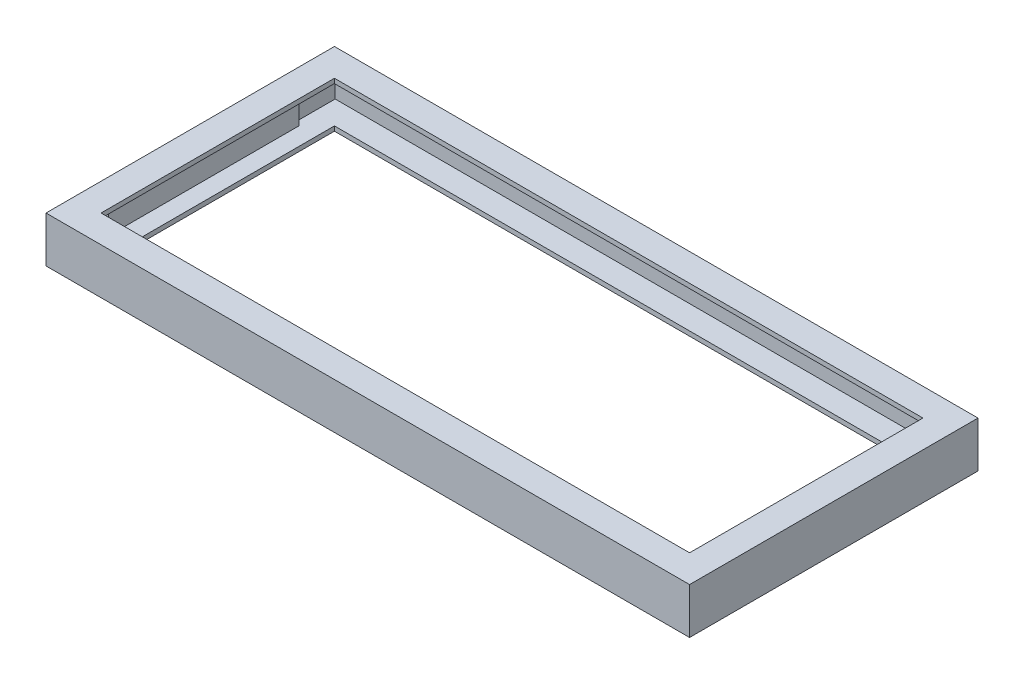
ISO-10303-21;
HEADER;
FILE_DESCRIPTION(('STEP AP214'),'2;1');
FILE_NAME('part.step','',(''),(''),'','','');
FILE_SCHEMA(('AUTOMOTIVE_DESIGN { 1 0 10303 214 1 1 1 1 }'));
ENDSEC;
DATA;
#1=APPLICATION_CONTEXT('core data for automotive mechanical design processes');
#2=APPLICATION_PROTOCOL_DEFINITION('international standard','automotive_design',2000,#1);
#3=PRODUCT_CONTEXT('',#1,'mechanical');
#4=PRODUCT('Part','Part','',(#3));
#5=PRODUCT_RELATED_PRODUCT_CATEGORY('part','',(#4));
#6=PRODUCT_DEFINITION_FORMATION('','',#4);
#7=PRODUCT_DEFINITION_CONTEXT('part definition',#1,'design');
#8=PRODUCT_DEFINITION('design','',#6,#7);
#9=PRODUCT_DEFINITION_SHAPE('','',#8);
#10=(LENGTH_UNIT() NAMED_UNIT(*) SI_UNIT(.MILLI.,.METRE.));
#11=(NAMED_UNIT(*) PLANE_ANGLE_UNIT() SI_UNIT($,.RADIAN.));
#12=(NAMED_UNIT(*) SI_UNIT($,.STERADIAN.) SOLID_ANGLE_UNIT());
#13=UNCERTAINTY_MEASURE_WITH_UNIT(LENGTH_MEASURE(1.E-05),#10,'distance_accuracy_value','');
#14=(GEOMETRIC_REPRESENTATION_CONTEXT(3) GLOBAL_UNCERTAINTY_ASSIGNED_CONTEXT((#13)) GLOBAL_UNIT_ASSIGNED_CONTEXT((#10,
#11,#12)) REPRESENTATION_CONTEXT('',''));
#15=CARTESIAN_POINT('',(0.,0.,0.));
#16=DIRECTION('',(0.,0.,1.));
#17=DIRECTION('',(1.,0.,0.));
#18=AXIS2_PLACEMENT_3D('',#15,#16,#17);
#19=CARTESIAN_POINT('',(0.,10.,0.));
#20=DIRECTION('',(0.,-1.,0.));
#21=DIRECTION('',(0.,0.,-1.));
#22=AXIS2_PLACEMENT_3D('',#19,#20,#21);
#23=PLANE('',#22);
#24=DIRECTION('',(1.,0.,0.));
#25=VECTOR('',#24,1.);
#26=CARTESIAN_POINT('',(6.00000000000001,10.,-6.));
#27=LINE('',#26,#25);
#28=CARTESIAN_POINT('',(6.00000000000001,10.,-6.));
#29=VERTEX_POINT('',#28);
#30=CARTESIAN_POINT('',(134.336754021494,10.,-6.));
#31=VERTEX_POINT('',#30);
#32=EDGE_CURVE('E253',#29,#31,#27,.T.);
#33=ORIENTED_EDGE('',*,*,#32,.F.);
#34=DIRECTION('',(0.,0.,1.));
#35=VECTOR('',#34,1.);
#36=CARTESIAN_POINT('',(6.,10.,-56.8948257352429));
#37=LINE('',#36,#35);
#38=CARTESIAN_POINT('',(6.,10.,-56.8948257352429));
#39=VERTEX_POINT('',#38);
#40=EDGE_CURVE('E50',#39,#29,#37,.T.);
#41=ORIENTED_EDGE('',*,*,#40,.F.);
#42=DIRECTION('',(-1.,0.,0.));
#43=VECTOR('',#42,1.);
#44=CARTESIAN_POINT('',(6.,10.,-56.8948257352429));
#45=LINE('',#44,#43);
#46=CARTESIAN_POINT('',(134.336754021494,10.,-56.8948257352429));
#47=VERTEX_POINT('',#46);
#48=EDGE_CURVE('E244',#47,#39,#45,.T.);
#49=ORIENTED_EDGE('',*,*,#48,.F.);
#50=DIRECTION('',(0.,0.,-1.));
#51=VECTOR('',#50,1.);
#52=CARTESIAN_POINT('',(134.336754021494,10.,-56.8948257352429));
#53=LINE('',#52,#51);
#54=EDGE_CURVE('E247',#31,#47,#53,.T.);
#55=ORIENTED_EDGE('',*,*,#54,.F.);
#56=EDGE_LOOP('',(#33,#41,#49,#55));
#57=FACE_BOUND('',#56,.T.);
#58=DIRECTION('',(0.,0.,1.));
#59=VECTOR('',#58,1.);
#60=CARTESIAN_POINT('',(0.,10.,0.));
#61=LINE('',#60,#59);
#62=CARTESIAN_POINT('',(0.,10.,-62.8948257352429));
#63=VERTEX_POINT('',#62);
#64=CARTESIAN_POINT('',(0.,10.,0.));
#65=VERTEX_POINT('',#64);
#66=EDGE_CURVE('E399',#63,#65,#61,.T.);
#67=ORIENTED_EDGE('',*,*,#66,.T.);
#68=DIRECTION('',(1.,0.,0.));
#69=VECTOR('',#68,1.);
#70=CARTESIAN_POINT('',(0.,10.,0.));
#71=LINE('',#70,#69);
#72=CARTESIAN_POINT('',(140.336754021494,10.,0.));
#73=VERTEX_POINT('',#72);
#74=EDGE_CURVE('E402',#65,#73,#71,.T.);
#75=ORIENTED_EDGE('',*,*,#74,.T.);
#76=DIRECTION('',(0.,0.,-1.));
#77=VECTOR('',#76,1.);
#78=CARTESIAN_POINT('',(140.336754021494,10.,-62.8948257352429));
#79=LINE('',#78,#77);
#80=CARTESIAN_POINT('',(140.336754021494,10.,-62.8948257352429));
#81=VERTEX_POINT('',#80);
#82=EDGE_CURVE('E405',#73,#81,#79,.T.);
#83=ORIENTED_EDGE('',*,*,#82,.T.);
#84=DIRECTION('',(-1.,0.,0.));
#85=VECTOR('',#84,1.);
#86=CARTESIAN_POINT('',(131.35177891646,10.,-62.8948257352429));
#87=LINE('',#86,#85);
#88=EDGE_CURVE('E407',#81,#63,#87,.T.);
#89=ORIENTED_EDGE('',*,*,#88,.T.);
#90=EDGE_LOOP('',(#67,#75,#83,#89));
#91=FACE_BOUND('',#90,.T.);
#92=ADVANCED_FACE('F35',(#57,#91),#23,.F.);
#93=CARTESIAN_POINT('',(0.,0.,0.));
#94=DIRECTION('',(0.,-1.,0.));
#95=DIRECTION('',(0.,0.,-1.));
#96=AXIS2_PLACEMENT_3D('',#93,#94,#95);
#97=PLANE('',#96);
#98=DIRECTION('',(0.,0.,1.));
#99=VECTOR('',#98,1.);
#100=CARTESIAN_POINT('',(6.,0.,-56.8948257352429));
#101=LINE('',#100,#99);
#102=CARTESIAN_POINT('',(6.,0.,-56.8948257352429));
#103=VERTEX_POINT('',#102);
#104=CARTESIAN_POINT('',(6.00000000000001,0.,-6.));
#105=VERTEX_POINT('',#104);
#106=EDGE_CURVE('E227',#103,#105,#101,.T.);
#107=ORIENTED_EDGE('',*,*,#106,.T.);
#108=DIRECTION('',(1.,0.,0.));
#109=VECTOR('',#108,1.);
#110=CARTESIAN_POINT('',(6.00000000000001,0.,-6.));
#111=LINE('',#110,#109);
#112=CARTESIAN_POINT('',(134.336754021494,0.,-6.));
#113=VERTEX_POINT('',#112);
#114=EDGE_CURVE('E235',#105,#113,#111,.T.);
#115=ORIENTED_EDGE('',*,*,#114,.T.);
#116=DIRECTION('',(0.,0.,-1.));
#117=VECTOR('',#116,1.);
#118=CARTESIAN_POINT('',(134.336754021494,0.,-56.8948257352429));
#119=LINE('',#118,#117);
#120=CARTESIAN_POINT('',(134.336754021494,0.,-56.8948257352429));
#121=VERTEX_POINT('',#120);
#122=EDGE_CURVE('E58',#113,#121,#119,.T.);
#123=ORIENTED_EDGE('',*,*,#122,.T.);
#124=DIRECTION('',(-1.,0.,0.));
#125=VECTOR('',#124,1.);
#126=CARTESIAN_POINT('',(6.,0.,-56.8948257352429));
#127=LINE('',#126,#125);
#128=EDGE_CURVE('E243',#121,#103,#127,.T.);
#129=ORIENTED_EDGE('',*,*,#128,.T.);
#130=EDGE_LOOP('',(#107,#115,#123,#129));
#131=FACE_BOUND('',#130,.T.);
#132=DIRECTION('',(0.,0.,1.));
#133=VECTOR('',#132,1.);
#134=CARTESIAN_POINT('',(0.,0.,0.));
#135=LINE('',#134,#133);
#136=CARTESIAN_POINT('',(0.,0.,-62.8948257352429));
#137=VERTEX_POINT('',#136);
#138=CARTESIAN_POINT('',(0.,0.,0.));
#139=VERTEX_POINT('',#138);
#140=EDGE_CURVE('E397',#137,#139,#135,.T.);
#141=ORIENTED_EDGE('',*,*,#140,.F.);
#142=DIRECTION('',(-1.,0.,0.));
#143=VECTOR('',#142,1.);
#144=CARTESIAN_POINT('',(0.,0.,-62.8948257352429));
#145=LINE('',#144,#143);
#146=CARTESIAN_POINT('',(140.336754021494,0.,-62.8948257352429));
#147=VERTEX_POINT('',#146);
#148=EDGE_CURVE('E403',#147,#137,#145,.T.);
#149=ORIENTED_EDGE('',*,*,#148,.F.);
#150=DIRECTION('',(0.,0.,-1.));
#151=VECTOR('',#150,1.);
#152=CARTESIAN_POINT('',(140.336754021494,0.,-62.8948257352429));
#153=LINE('',#152,#151);
#154=CARTESIAN_POINT('',(140.336754021494,0.,0.));
#155=VERTEX_POINT('',#154);
#156=EDGE_CURVE('E414',#155,#147,#153,.T.);
#157=ORIENTED_EDGE('',*,*,#156,.F.);
#158=DIRECTION('',(1.,0.,0.));
#159=VECTOR('',#158,1.);
#160=CARTESIAN_POINT('',(131.35177891646,0.,0.));
#161=LINE('',#160,#159);
#162=EDGE_CURVE('E412',#139,#155,#161,.T.);
#163=ORIENTED_EDGE('',*,*,#162,.F.);
#164=EDGE_LOOP('',(#141,#149,#157,#163));
#165=FACE_BOUND('',#164,.T.);
#166=ADVANCED_FACE('F240',(#131,#165),#97,.T.);
#167=CARTESIAN_POINT('',(0.,10.,0.));
#168=DIRECTION('',(1.,0.,0.));
#169=DIRECTION('',(0.,0.,-1.));
#170=AXIS2_PLACEMENT_3D('',#167,#168,#169);
#171=PLANE('',#170);
#172=ORIENTED_EDGE('',*,*,#140,.T.);
#173=DIRECTION('',(0.,-1.,0.));
#174=VECTOR('',#173,1.);
#175=CARTESIAN_POINT('',(0.,10.,0.));
#176=LINE('',#175,#174);
#177=EDGE_CURVE('E426',#65,#139,#176,.T.);
#178=ORIENTED_EDGE('',*,*,#177,.F.);
#179=ORIENTED_EDGE('',*,*,#66,.F.);
#180=DIRECTION('',(0.,-1.,0.));
#181=VECTOR('',#180,1.);
#182=CARTESIAN_POINT('',(0.,10.,-62.8948257352429));
#183=LINE('',#182,#181);
#184=EDGE_CURVE('E409',#63,#137,#183,.T.);
#185=ORIENTED_EDGE('',*,*,#184,.T.);
#186=EDGE_LOOP('',(#172,#178,#179,#185));
#187=FACE_BOUND('',#186,.T.);
#188=ADVANCED_FACE('F37',(#187),#171,.F.);
#189=CARTESIAN_POINT('',(131.35177891646,10.,0.));
#190=DIRECTION('',(0.,0.,-1.));
#191=DIRECTION('',(-1.,0.,0.));
#192=AXIS2_PLACEMENT_3D('',#189,#190,#191);
#193=PLANE('',#192);
#194=ORIENTED_EDGE('',*,*,#162,.T.);
#195=DIRECTION('',(0.,-1.,0.));
#196=VECTOR('',#195,1.);
#197=CARTESIAN_POINT('',(140.336754021494,10.,0.));
#198=LINE('',#197,#196);
#199=EDGE_CURVE('E423',#73,#155,#198,.T.);
#200=ORIENTED_EDGE('',*,*,#199,.F.);
#201=ORIENTED_EDGE('',*,*,#74,.F.);
#202=ORIENTED_EDGE('',*,*,#177,.T.);
#203=EDGE_LOOP('',(#194,#200,#201,#202));
#204=FACE_BOUND('',#203,.T.);
#205=ADVANCED_FACE('F474',(#204),#193,.F.);
#206=CARTESIAN_POINT('',(140.336754021494,10.,-62.8948257352429));
#207=DIRECTION('',(-1.,0.,0.));
#208=DIRECTION('',(0.,0.,1.));
#209=AXIS2_PLACEMENT_3D('',#206,#207,#208);
#210=PLANE('',#209);
#211=ORIENTED_EDGE('',*,*,#156,.T.);
#212=DIRECTION('',(0.,-1.,0.));
#213=VECTOR('',#212,1.);
#214=CARTESIAN_POINT('',(140.336754021494,10.,-62.8948257352429));
#215=LINE('',#214,#213);
#216=EDGE_CURVE('E420',#81,#147,#215,.T.);
#217=ORIENTED_EDGE('',*,*,#216,.F.);
#218=ORIENTED_EDGE('',*,*,#82,.F.);
#219=ORIENTED_EDGE('',*,*,#199,.T.);
#220=EDGE_LOOP('',(#211,#217,#218,#219));
#221=FACE_BOUND('',#220,.T.);
#222=ADVANCED_FACE('F471',(#221),#210,.F.);
#223=CARTESIAN_POINT('',(0.,10.,-62.8948257352429));
#224=DIRECTION('',(0.,0.,1.));
#225=DIRECTION('',(1.,0.,0.));
#226=AXIS2_PLACEMENT_3D('',#223,#224,#225);
#227=PLANE('',#226);
#228=ORIENTED_EDGE('',*,*,#148,.T.);
#229=ORIENTED_EDGE('',*,*,#184,.F.);
#230=ORIENTED_EDGE('',*,*,#88,.F.);
#231=ORIENTED_EDGE('',*,*,#216,.T.);
#232=EDGE_LOOP('',(#228,#229,#230,#231));
#233=FACE_BOUND('',#232,.T.);
#234=ADVANCED_FACE('F451',(#233),#227,.F.);
#235=CARTESIAN_POINT('',(6.00000000000001,0.,-6.));
#236=DIRECTION('',(0.,0.,1.));
#237=DIRECTION('',(1.,0.,0.));
#238=AXIS2_PLACEMENT_3D('',#235,#236,#237);
#239=PLANE('',#238);
#240=DIRECTION('',(0.,1.,0.));
#241=VECTOR('',#240,1.);
#242=CARTESIAN_POINT('',(134.336754021494,0.,-6.));
#243=LINE('',#242,#241);
#244=CARTESIAN_POINT('',(134.336754021494,1.,-6.));
#245=VERTEX_POINT('',#244);
#246=EDGE_CURVE('E237',#113,#245,#243,.T.);
#247=ORIENTED_EDGE('',*,*,#246,.F.);
#248=ORIENTED_EDGE('',*,*,#114,.F.);
#249=DIRECTION('',(0.,1.,0.));
#250=VECTOR('',#249,1.);
#251=CARTESIAN_POINT('',(6.00000000000001,0.,-6.));
#252=LINE('',#251,#250);
#253=CARTESIAN_POINT('',(6.00000000000001,1.,-6.));
#254=VERTEX_POINT('',#253);
#255=EDGE_CURVE('E222',#105,#254,#252,.T.);
#256=ORIENTED_EDGE('',*,*,#255,.T.);
#257=DIRECTION('',(-1.,0.,0.));
#258=VECTOR('',#257,1.);
#259=CARTESIAN_POINT('',(2.12425489194774,1.,-6.));
#260=LINE('',#259,#258);
#261=EDGE_CURVE('E431',#245,#254,#260,.T.);
#262=ORIENTED_EDGE('',*,*,#261,.F.);
#263=EDGE_LOOP('',(#247,#248,#256,#262));
#264=FACE_BOUND('',#263,.T.);
#265=ADVANCED_FACE('F236',(#264),#239,.F.);
#266=CARTESIAN_POINT('',(134.336754021494,0.,-56.8948257352429));
#267=DIRECTION('',(1.,0.,0.));
#268=DIRECTION('',(0.,0.,-1.));
#269=AXIS2_PLACEMENT_3D('',#266,#267,#268);
#270=PLANE('',#269);
#271=DIRECTION('',(0.,1.,0.));
#272=VECTOR('',#271,1.);
#273=CARTESIAN_POINT('',(134.336754021494,0.,-56.8948257352429));
#274=LINE('',#273,#272);
#275=CARTESIAN_POINT('',(134.336754021494,1.,-56.8948257352429));
#276=VERTEX_POINT('',#275);
#277=EDGE_CURVE('E262',#121,#276,#274,.T.);
#278=ORIENTED_EDGE('',*,*,#277,.F.);
#279=ORIENTED_EDGE('',*,*,#122,.F.);
#280=ORIENTED_EDGE('',*,*,#246,.T.);
#281=DIRECTION('',(0.,0.,1.));
#282=VECTOR('',#281,1.);
#283=CARTESIAN_POINT('',(134.336754021494,1.,-1.));
#284=LINE('',#283,#282);
#285=EDGE_CURVE('E433',#276,#245,#284,.T.);
#286=ORIENTED_EDGE('',*,*,#285,.F.);
#287=EDGE_LOOP('',(#278,#279,#280,#286));
#288=FACE_BOUND('',#287,.T.);
#289=ADVANCED_FACE('F441',(#288),#270,.F.);
#290=CARTESIAN_POINT('',(6.,0.,-56.8948257352429));
#291=DIRECTION('',(0.,0.,-1.));
#292=DIRECTION('',(-1.,0.,0.));
#293=AXIS2_PLACEMENT_3D('',#290,#291,#292);
#294=PLANE('',#293);
#295=DIRECTION('',(0.,1.,0.));
#296=VECTOR('',#295,1.);
#297=CARTESIAN_POINT('',(6.,0.,-56.8948257352429));
#298=LINE('',#297,#296);
#299=CARTESIAN_POINT('',(6.,1.,-56.8948257352429));
#300=VERTEX_POINT('',#299);
#301=EDGE_CURVE('E258',#103,#300,#298,.T.);
#302=ORIENTED_EDGE('',*,*,#301,.F.);
#303=ORIENTED_EDGE('',*,*,#128,.F.);
#304=ORIENTED_EDGE('',*,*,#277,.T.);
#305=DIRECTION('',(1.,0.,0.));
#306=VECTOR('',#305,1.);
#307=CARTESIAN_POINT('',(2.12425489194774,1.,-56.8948257352429));
#308=LINE('',#307,#306);
#309=EDGE_CURVE('E43',#300,#276,#308,.T.);
#310=ORIENTED_EDGE('',*,*,#309,.F.);
#311=EDGE_LOOP('',(#302,#303,#304,#310));
#312=FACE_BOUND('',#311,.T.);
#313=ADVANCED_FACE('F440',(#312),#294,.F.);
#314=CARTESIAN_POINT('',(6.,0.,-56.8948257352429));
#315=DIRECTION('',(-1.,0.,0.));
#316=DIRECTION('',(0.,0.,1.));
#317=AXIS2_PLACEMENT_3D('',#314,#315,#316);
#318=PLANE('',#317);
#319=ORIENTED_EDGE('',*,*,#255,.F.);
#320=ORIENTED_EDGE('',*,*,#106,.F.);
#321=ORIENTED_EDGE('',*,*,#301,.T.);
#322=DIRECTION('',(0.,0.,-1.));
#323=VECTOR('',#322,1.);
#324=CARTESIAN_POINT('',(6.00000000000001,1.,-1.));
#325=LINE('',#324,#323);
#326=EDGE_CURVE('E11',#254,#300,#325,.T.);
#327=ORIENTED_EDGE('',*,*,#326,.F.);
#328=EDGE_LOOP('',(#319,#320,#321,#327));
#329=FACE_BOUND('',#328,.T.);
#330=ADVANCED_FACE('F224',(#329),#318,.F.);
#331=CARTESIAN_POINT('',(6.,9.,-56.8948257352429));
#332=VERTEX_POINT('',#331);
#333=EDGE_CURVE('E261',#332,#39,#298,.T.);
#334=ORIENTED_EDGE('',*,*,#333,.T.);
#335=ORIENTED_EDGE('',*,*,#40,.T.);
#336=CARTESIAN_POINT('',(6.00000000000001,9.,-6.));
#337=VERTEX_POINT('',#336);
#338=EDGE_CURVE('E232',#337,#29,#252,.T.);
#339=ORIENTED_EDGE('',*,*,#338,.F.);
#340=DIRECTION('',(0.,0.,1.));
#341=VECTOR('',#340,1.);
#342=CARTESIAN_POINT('',(6.00000000000001,9.,-1.));
#343=LINE('',#342,#341);
#344=EDGE_CURVE('E275',#332,#337,#343,.T.);
#345=ORIENTED_EDGE('',*,*,#344,.F.);
#346=EDGE_LOOP('',(#334,#335,#339,#345));
#347=FACE_BOUND('',#346,.T.);
#348=ADVANCED_FACE('F526',(#347),#318,.F.);
#349=CARTESIAN_POINT('',(134.336754021494,9.,-56.8948257352429));
#350=VERTEX_POINT('',#349);
#351=EDGE_CURVE('E265',#350,#47,#274,.T.);
#352=ORIENTED_EDGE('',*,*,#351,.T.);
#353=ORIENTED_EDGE('',*,*,#48,.T.);
#354=ORIENTED_EDGE('',*,*,#333,.F.);
#355=DIRECTION('',(-1.,0.,0.));
#356=VECTOR('',#355,1.);
#357=CARTESIAN_POINT('',(2.12425489194774,9.,-56.8948257352429));
#358=LINE('',#357,#356);
#359=EDGE_CURVE('E272',#350,#332,#358,.T.);
#360=ORIENTED_EDGE('',*,*,#359,.F.);
#361=EDGE_LOOP('',(#352,#353,#354,#360));
#362=FACE_BOUND('',#361,.T.);
#363=ADVANCED_FACE('F450',(#362),#294,.F.);
#364=CARTESIAN_POINT('',(134.336754021494,9.,-6.));
#365=VERTEX_POINT('',#364);
#366=EDGE_CURVE('E231',#365,#31,#243,.T.);
#367=ORIENTED_EDGE('',*,*,#366,.T.);
#368=ORIENTED_EDGE('',*,*,#54,.T.);
#369=ORIENTED_EDGE('',*,*,#351,.F.);
#370=DIRECTION('',(0.,0.,-1.));
#371=VECTOR('',#370,1.);
#372=CARTESIAN_POINT('',(134.336754021494,9.,-1.));
#373=LINE('',#372,#371);
#374=EDGE_CURVE('E269',#365,#350,#373,.T.);
#375=ORIENTED_EDGE('',*,*,#374,.F.);
#376=EDGE_LOOP('',(#367,#368,#369,#375));
#377=FACE_BOUND('',#376,.T.);
#378=ADVANCED_FACE('F444',(#377),#270,.F.);
#379=ORIENTED_EDGE('',*,*,#338,.T.);
#380=ORIENTED_EDGE('',*,*,#32,.T.);
#381=ORIENTED_EDGE('',*,*,#366,.F.);
#382=DIRECTION('',(1.,0.,0.));
#383=VECTOR('',#382,1.);
#384=CARTESIAN_POINT('',(2.12425489194774,9.,-6.));
#385=LINE('',#384,#383);
#386=EDGE_CURVE('E260',#337,#365,#385,.T.);
#387=ORIENTED_EDGE('',*,*,#386,.F.);
#388=EDGE_LOOP('',(#379,#380,#381,#387));
#389=FACE_BOUND('',#388,.T.);
#390=ADVANCED_FACE('F453',(#389),#239,.F.);
#391=CARTESIAN_POINT('',(11.1242548919477,0.,0.));
#392=DIRECTION('',(1.,0.,0.));
#393=DIRECTION('',(0.,0.,-1.));
#394=AXIS2_PLACEMENT_3D('',#391,#392,#393);
#395=PLANE('',#394);
#396=DIRECTION('',(0.,1.,0.));
#397=VECTOR('',#396,1.);
#398=CARTESIAN_POINT('',(11.1242548919477,0.,-2.55211084933033));
#399=LINE('',#398,#397);
#400=CARTESIAN_POINT('',(11.1242548919478,1.,-2.55211084933033));
#401=VERTEX_POINT('',#400);
#402=CARTESIAN_POINT('',(11.1242548919478,9.,-2.55211084933033));
#403=VERTEX_POINT('',#402);
#404=EDGE_CURVE('E302',#401,#403,#399,.T.);
#405=ORIENTED_EDGE('',*,*,#404,.F.);
#406=DIRECTION('',(0.,0.,-1.));
#407=VECTOR('',#406,1.);
#408=CARTESIAN_POINT('',(11.1242548919477,1.,-1.));
#409=LINE('',#408,#407);
#410=CARTESIAN_POINT('',(11.1242548919477,1.,-1.));
#411=VERTEX_POINT('',#410);
#412=EDGE_CURVE('E390',#411,#401,#409,.T.);
#413=ORIENTED_EDGE('',*,*,#412,.F.);
#414=DIRECTION('',(0.,-1.,0.));
#415=VECTOR('',#414,1.);
#416=CARTESIAN_POINT('',(11.1242548919477,9.,-1.));
#417=LINE('',#416,#415);
#418=CARTESIAN_POINT('',(11.1242548919477,9.,-1.));
#419=VERTEX_POINT('',#418);
#420=EDGE_CURVE('E367',#419,#411,#417,.T.);
#421=ORIENTED_EDGE('',*,*,#420,.F.);
#422=DIRECTION('',(0.,0.,1.));
#423=VECTOR('',#422,1.);
#424=CARTESIAN_POINT('',(11.1242548919477,9.,-1.));
#425=LINE('',#424,#423);
#426=EDGE_CURVE('E379',#403,#419,#425,.T.);
#427=ORIENTED_EDGE('',*,*,#426,.F.);
#428=EDGE_LOOP('',(#405,#413,#421,#427));
#429=FACE_BOUND('',#428,.T.);
#430=ADVANCED_FACE('F556',(#429),#395,.F.);
#431=CARTESIAN_POINT('',(2.12425489194774,9.,-1.));
#432=DIRECTION('',(0.,0.,1.));
#433=DIRECTION('',(0.,-1.,0.));
#434=AXIS2_PLACEMENT_3D('',#431,#432,#433);
#435=PLANE('',#434);
#436=ORIENTED_EDGE('',*,*,#420,.T.);
#437=DIRECTION('',(1.,0.,0.));
#438=VECTOR('',#437,1.);
#439=CARTESIAN_POINT('',(2.12425489194774,1.,-1.));
#440=LINE('',#439,#438);
#441=CARTESIAN_POINT('',(2.12425489194774,1.,-1.));
#442=VERTEX_POINT('',#441);
#443=EDGE_CURVE('E387',#442,#411,#440,.T.);
#444=ORIENTED_EDGE('',*,*,#443,.F.);
#445=DIRECTION('',(0.,-1.,0.));
#446=VECTOR('',#445,1.);
#447=CARTESIAN_POINT('',(2.12425489194774,9.,-1.));
#448=LINE('',#447,#446);
#449=CARTESIAN_POINT('',(2.12425489194774,9.,-1.));
#450=VERTEX_POINT('',#449);
#451=EDGE_CURVE('E375',#450,#442,#448,.T.);
#452=ORIENTED_EDGE('',*,*,#451,.F.);
#453=DIRECTION('',(1.,0.,0.));
#454=VECTOR('',#453,1.);
#455=CARTESIAN_POINT('',(2.12425489194774,9.,-1.));
#456=LINE('',#455,#454);
#457=EDGE_CURVE('E394',#450,#419,#456,.T.);
#458=ORIENTED_EDGE('',*,*,#457,.T.);
#459=EDGE_LOOP('',(#436,#444,#452,#458));
#460=FACE_BOUND('',#459,.T.);
#461=ADVANCED_FACE('F466',(#460),#435,.F.);
#462=CARTESIAN_POINT('',(2.12425489194774,0.,0.));
#463=DIRECTION('',(1.,0.,0.));
#464=DIRECTION('',(0.,0.,-1.));
#465=AXIS2_PLACEMENT_3D('',#462,#463,#464);
#466=PLANE('',#465);
#467=DIRECTION('',(0.,0.,-1.));
#468=VECTOR('',#467,1.);
#469=CARTESIAN_POINT('',(2.12425489194774,1.,-1.));
#470=LINE('',#469,#468);
#471=CARTESIAN_POINT('',(2.12425489194779,1.,-2.55211084933033));
#472=VERTEX_POINT('',#471);
#473=EDGE_CURVE('E380',#442,#472,#470,.T.);
#474=ORIENTED_EDGE('',*,*,#473,.T.);
#475=DIRECTION('',(0.,1.,0.));
#476=VECTOR('',#475,1.);
#477=CARTESIAN_POINT('',(2.12425489194774,0.,-2.55211084933033));
#478=LINE('',#477,#476);
#479=CARTESIAN_POINT('',(2.12425489194779,9.,-2.55211084933033));
#480=VERTEX_POINT('',#479);
#481=EDGE_CURVE('E304',#472,#480,#478,.T.);
#482=ORIENTED_EDGE('',*,*,#481,.T.);
#483=DIRECTION('',(0.,0.,1.));
#484=VECTOR('',#483,1.);
#485=CARTESIAN_POINT('',(2.12425489194774,9.,-1.));
#486=LINE('',#485,#484);
#487=EDGE_CURVE('E383',#480,#450,#486,.T.);
#488=ORIENTED_EDGE('',*,*,#487,.T.);
#489=ORIENTED_EDGE('',*,*,#451,.T.);
#490=EDGE_LOOP('',(#474,#482,#488,#489));
#491=FACE_BOUND('',#490,.T.);
#492=ADVANCED_FACE('F606',(#491),#466,.T.);
#493=CARTESIAN_POINT('',(0.,0.,-2.55211084933033));
#494=DIRECTION('',(0.,0.,-1.));
#495=DIRECTION('',(-1.,0.,0.));
#496=AXIS2_PLACEMENT_3D('',#493,#494,#495);
#497=PLANE('',#496);
#498=DIRECTION('',(-1.,0.,0.));
#499=VECTOR('',#498,1.);
#500=CARTESIAN_POINT('',(139.336754021494,1.,-2.55211084933033));
#501=LINE('',#500,#499);
#502=CARTESIAN_POINT('',(1.,1.,-2.55211084933033));
#503=VERTEX_POINT('',#502);
#504=EDGE_CURVE('E279',#472,#503,#501,.T.);
#505=ORIENTED_EDGE('',*,*,#504,.T.);
#506=DIRECTION('',(0.,1.,0.));
#507=VECTOR('',#506,1.);
#508=CARTESIAN_POINT('',(1.,9.,-2.55211084933033));
#509=LINE('',#508,#507);
#510=CARTESIAN_POINT('',(1.,9.,-2.55211084933033));
#511=VERTEX_POINT('',#510);
#512=EDGE_CURVE('E283',#503,#511,#509,.T.);
#513=ORIENTED_EDGE('',*,*,#512,.T.);
#514=DIRECTION('',(1.,0.,0.));
#515=VECTOR('',#514,1.);
#516=CARTESIAN_POINT('',(139.336754021494,9.,-2.55211084933033));
#517=LINE('',#516,#515);
#518=EDGE_CURVE('E287',#511,#480,#517,.T.);
#519=ORIENTED_EDGE('',*,*,#518,.T.);
#520=ORIENTED_EDGE('',*,*,#481,.F.);
#521=EDGE_LOOP('',(#505,#513,#519,#520));
#522=FACE_BOUND('',#521,.T.);
#523=ADVANCED_FACE('F590',(#522),#497,.T.);
#524=CARTESIAN_POINT('',(1.,9.,-2.55211084933033));
#525=DIRECTION('',(-1.,0.,0.));
#526=DIRECTION('',(0.,0.,1.));
#527=AXIS2_PLACEMENT_3D('',#524,#525,#526);
#528=PLANE('',#527);
#529=DIRECTION('',(0.,1.,0.));
#530=VECTOR('',#529,1.);
#531=CARTESIAN_POINT('',(1.,9.,-11.5521108493303));
#532=LINE('',#531,#530);
#533=CARTESIAN_POINT('',(1.,1.,-11.5521108493303));
#534=VERTEX_POINT('',#533);
#535=CARTESIAN_POINT('',(1.,9.,-11.5521108493303));
#536=VERTEX_POINT('',#535);
#537=EDGE_CURVE('E291',#534,#536,#532,.T.);
#538=ORIENTED_EDGE('',*,*,#537,.T.);
#539=DIRECTION('',(0.,0.,-1.));
#540=VECTOR('',#539,1.);
#541=CARTESIAN_POINT('',(1.,9.,-2.55211084933033));
#542=LINE('',#541,#540);
#543=EDGE_CURVE('E296',#511,#536,#542,.T.);
#544=ORIENTED_EDGE('',*,*,#543,.F.);
#545=ORIENTED_EDGE('',*,*,#512,.F.);
#546=DIRECTION('',(0.,0.,-1.));
#547=VECTOR('',#546,1.);
#548=CARTESIAN_POINT('',(1.,1.,-2.55211084933033));
#549=LINE('',#548,#547);
#550=EDGE_CURVE('E289',#503,#534,#549,.T.);
#551=ORIENTED_EDGE('',*,*,#550,.T.);
#552=EDGE_LOOP('',(#538,#544,#545,#551));
#553=FACE_BOUND('',#552,.T.);
#554=ADVANCED_FACE('F605',(#553),#528,.F.);
#555=CARTESIAN_POINT('',(0.,0.,-11.5521108493303));
#556=DIRECTION('',(0.,0.,-1.));
#557=DIRECTION('',(-1.,0.,0.));
#558=AXIS2_PLACEMENT_3D('',#555,#556,#557);
#559=PLANE('',#558);
#560=DIRECTION('',(0.,1.,0.));
#561=VECTOR('',#560,1.);
#562=CARTESIAN_POINT('',(2.12425489194774,0.,-11.5521108493303));
#563=LINE('',#562,#561);
#564=CARTESIAN_POINT('',(2.12425489194774,1.,-11.5521108493303));
#565=VERTEX_POINT('',#564);
#566=CARTESIAN_POINT('',(2.12425489194779,9.,-11.5521108493303));
#567=VERTEX_POINT('',#566);
#568=EDGE_CURVE('E298',#565,#567,#563,.T.);
#569=ORIENTED_EDGE('',*,*,#568,.T.);
#570=DIRECTION('',(1.,0.,0.));
#571=VECTOR('',#570,1.);
#572=CARTESIAN_POINT('',(139.336754021494,9.,-11.5521108493303));
#573=LINE('',#572,#571);
#574=EDGE_CURVE('E282',#536,#567,#573,.T.);
#575=ORIENTED_EDGE('',*,*,#574,.F.);
#576=ORIENTED_EDGE('',*,*,#537,.F.);
#577=DIRECTION('',(-1.,0.,0.));
#578=VECTOR('',#577,1.);
#579=CARTESIAN_POINT('',(139.336754021494,1.,-11.5521108493303));
#580=LINE('',#579,#578);
#581=EDGE_CURVE('E278',#565,#534,#580,.T.);
#582=ORIENTED_EDGE('',*,*,#581,.F.);
#583=EDGE_LOOP('',(#569,#575,#576,#582));
#584=FACE_BOUND('',#583,.T.);
#585=ADVANCED_FACE('F614',(#584),#559,.F.);
#586=ORIENTED_EDGE('',*,*,#568,.F.);
#587=CARTESIAN_POINT('',(2.12425489194774,1.,-53.054138715443));
#588=VERTEX_POINT('',#587);
#589=EDGE_CURVE('E378',#565,#588,#470,.T.);
#590=ORIENTED_EDGE('',*,*,#589,.T.);
#591=DIRECTION('',(0.,-1.,0.));
#592=VECTOR('',#591,1.);
#593=CARTESIAN_POINT('',(2.12425489194774,0.,-53.054138715443));
#594=LINE('',#593,#592);
#595=CARTESIAN_POINT('',(2.12425489194774,9.,-53.054138715443));
#596=VERTEX_POINT('',#595);
#597=EDGE_CURVE('E331',#596,#588,#594,.T.);
#598=ORIENTED_EDGE('',*,*,#597,.F.);
#599=EDGE_CURVE('E384',#596,#567,#486,.T.);
#600=ORIENTED_EDGE('',*,*,#599,.T.);
#601=EDGE_LOOP('',(#586,#590,#598,#600));
#602=FACE_BOUND('',#601,.T.);
#603=ADVANCED_FACE('F597',(#602),#466,.T.);
#604=CARTESIAN_POINT('',(0.,0.,-53.054138715443));
#605=DIRECTION('',(0.,0.,1.));
#606=DIRECTION('',(1.,0.,0.));
#607=AXIS2_PLACEMENT_3D('',#604,#605,#606);
#608=PLANE('',#607);
#609=ORIENTED_EDGE('',*,*,#597,.T.);
#610=DIRECTION('',(1.,0.,0.));
#611=VECTOR('',#610,1.);
#612=CARTESIAN_POINT('',(1.,1.,-53.054138715443));
#613=LINE('',#612,#611);
#614=CARTESIAN_POINT('',(1.,1.,-53.054138715443));
#615=VERTEX_POINT('',#614);
#616=EDGE_CURVE('E324',#615,#588,#613,.T.);
#617=ORIENTED_EDGE('',*,*,#616,.F.);
#618=DIRECTION('',(0.,-1.,0.));
#619=VECTOR('',#618,1.);
#620=CARTESIAN_POINT('',(1.,9.,-53.054138715443));
#621=LINE('',#620,#619);
#622=CARTESIAN_POINT('',(1.,9.,-53.054138715443));
#623=VERTEX_POINT('',#622);
#624=EDGE_CURVE('E307',#623,#615,#621,.T.);
#625=ORIENTED_EDGE('',*,*,#624,.F.);
#626=DIRECTION('',(-1.,0.,0.));
#627=VECTOR('',#626,1.);
#628=CARTESIAN_POINT('',(1.,9.,-53.054138715443));
#629=LINE('',#628,#627);
#630=EDGE_CURVE('E312',#596,#623,#629,.T.);
#631=ORIENTED_EDGE('',*,*,#630,.F.);
#632=EDGE_LOOP('',(#609,#617,#625,#631));
#633=FACE_BOUND('',#632,.T.);
#634=ADVANCED_FACE('F635',(#633),#608,.F.);
#635=CARTESIAN_POINT('',(1.,9.,-62.054138715443));
#636=DIRECTION('',(-1.,0.,0.));
#637=DIRECTION('',(0.,-1.,0.));
#638=AXIS2_PLACEMENT_3D('',#635,#636,#637);
#639=PLANE('',#638);
#640=ORIENTED_EDGE('',*,*,#624,.T.);
#641=DIRECTION('',(0.,0.,1.));
#642=VECTOR('',#641,1.);
#643=CARTESIAN_POINT('',(1.,1.,-62.054138715443));
#644=LINE('',#643,#642);
#645=CARTESIAN_POINT('',(1.,1.,-62.054138715443));
#646=VERTEX_POINT('',#645);
#647=EDGE_CURVE('E321',#646,#615,#644,.T.);
#648=ORIENTED_EDGE('',*,*,#647,.F.);
#649=DIRECTION('',(0.,-1.,0.));
#650=VECTOR('',#649,1.);
#651=CARTESIAN_POINT('',(1.,9.,-62.054138715443));
#652=LINE('',#651,#650);
#653=CARTESIAN_POINT('',(1.,9.,-62.054138715443));
#654=VERTEX_POINT('',#653);
#655=EDGE_CURVE('E308',#654,#646,#652,.T.);
#656=ORIENTED_EDGE('',*,*,#655,.F.);
#657=DIRECTION('',(0.,0.,1.));
#658=VECTOR('',#657,1.);
#659=CARTESIAN_POINT('',(1.,9.,-62.054138715443));
#660=LINE('',#659,#658);
#661=EDGE_CURVE('E328',#654,#623,#660,.T.);
#662=ORIENTED_EDGE('',*,*,#661,.T.);
#663=EDGE_LOOP('',(#640,#648,#656,#662));
#664=FACE_BOUND('',#663,.T.);
#665=ADVANCED_FACE('F633',(#664),#639,.F.);
#666=CARTESIAN_POINT('',(0.,0.,-62.054138715443));
#667=DIRECTION('',(0.,0.,1.));
#668=DIRECTION('',(1.,0.,0.));
#669=AXIS2_PLACEMENT_3D('',#666,#667,#668);
#670=PLANE('',#669);
#671=ORIENTED_EDGE('',*,*,#655,.T.);
#672=DIRECTION('',(1.,0.,0.));
#673=VECTOR('',#672,1.);
#674=CARTESIAN_POINT('',(1.,1.,-62.054138715443));
#675=LINE('',#674,#673);
#676=CARTESIAN_POINT('',(139.336754021494,1.,-62.054138715443));
#677=VERTEX_POINT('',#676);
#678=EDGE_CURVE('E311',#646,#677,#675,.T.);
#679=ORIENTED_EDGE('',*,*,#678,.T.);
#680=DIRECTION('',(0.,1.,0.));
#681=VECTOR('',#680,1.);
#682=CARTESIAN_POINT('',(139.336754021494,9.,-62.054138715443));
#683=LINE('',#682,#681);
#684=CARTESIAN_POINT('',(139.336754021494,9.,-62.054138715443));
#685=VERTEX_POINT('',#684);
#686=EDGE_CURVE('E315',#677,#685,#683,.T.);
#687=ORIENTED_EDGE('',*,*,#686,.T.);
#688=DIRECTION('',(-1.,0.,0.));
#689=VECTOR('',#688,1.);
#690=CARTESIAN_POINT('',(1.,9.,-62.054138715443));
#691=LINE('',#690,#689);
#692=EDGE_CURVE('E318',#685,#654,#691,.T.);
#693=ORIENTED_EDGE('',*,*,#692,.T.);
#694=EDGE_LOOP('',(#671,#679,#687,#693));
#695=FACE_BOUND('',#694,.T.);
#696=ADVANCED_FACE('F629',(#695),#670,.T.);
#697=CARTESIAN_POINT('',(139.336754021494,9.,-62.054138715443));
#698=DIRECTION('',(1.,0.,0.));
#699=DIRECTION('',(0.,0.,-1.));
#700=AXIS2_PLACEMENT_3D('',#697,#698,#699);
#701=PLANE('',#700);
#702=DIRECTION('',(0.,0.,1.));
#703=VECTOR('',#702,1.);
#704=CARTESIAN_POINT('',(139.336754021494,9.,-62.054138715443));
#705=LINE('',#704,#703);
#706=CARTESIAN_POINT('',(139.336754021494,9.,-61.8948257352429));
#707=VERTEX_POINT('',#706);
#708=EDGE_CURVE('E332',#685,#707,#705,.T.);
#709=ORIENTED_EDGE('',*,*,#708,.F.);
#710=ORIENTED_EDGE('',*,*,#686,.F.);
#711=DIRECTION('',(0.,0.,1.));
#712=VECTOR('',#711,1.);
#713=CARTESIAN_POINT('',(139.336754021494,1.,-62.054138715443));
#714=LINE('',#713,#712);
#715=CARTESIAN_POINT('',(139.336754021494,1.,-61.8948257352429));
#716=VERTEX_POINT('',#715);
#717=EDGE_CURVE('E335',#677,#716,#714,.T.);
#718=ORIENTED_EDGE('',*,*,#717,.T.);
#719=DIRECTION('',(0.,-1.,0.));
#720=VECTOR('',#719,1.);
#721=CARTESIAN_POINT('',(139.336754021494,9.,-61.8948257352429));
#722=LINE('',#721,#720);
#723=EDGE_CURVE('E340',#707,#716,#722,.T.);
#724=ORIENTED_EDGE('',*,*,#723,.F.);
#725=EDGE_LOOP('',(#709,#710,#718,#724));
#726=FACE_BOUND('',#725,.T.);
#727=ADVANCED_FACE('F632',(#726),#701,.F.);
#728=CARTESIAN_POINT('',(139.35177891646,9.,-61.8948257352429));
#729=DIRECTION('',(0.,0.,-1.));
#730=DIRECTION('',(-1.,0.,0.));
#731=AXIS2_PLACEMENT_3D('',#728,#729,#730);
#732=PLANE('',#731);
#733=DIRECTION('',(-1.,0.,0.));
#734=VECTOR('',#733,1.);
#735=CARTESIAN_POINT('',(139.35177891646,9.,-61.8948257352429));
#736=LINE('',#735,#734);
#737=CARTESIAN_POINT('',(139.35177891646,9.,-61.8948257352429));
#738=VERTEX_POINT('',#737);
#739=EDGE_CURVE('E364',#738,#707,#736,.T.);
#740=ORIENTED_EDGE('',*,*,#739,.T.);
#741=ORIENTED_EDGE('',*,*,#723,.T.);
#742=DIRECTION('',(-1.,0.,0.));
#743=VECTOR('',#742,1.);
#744=CARTESIAN_POINT('',(139.35177891646,1.,-61.8948257352429));
#745=LINE('',#744,#743);
#746=CARTESIAN_POINT('',(139.35177891646,1.,-61.8948257352429));
#747=VERTEX_POINT('',#746);
#748=EDGE_CURVE('E357',#747,#716,#745,.T.);
#749=ORIENTED_EDGE('',*,*,#748,.F.);
#750=DIRECTION('',(0.,-1.,0.));
#751=VECTOR('',#750,1.);
#752=CARTESIAN_POINT('',(139.35177891646,9.,-61.8948257352429));
#753=LINE('',#752,#751);
#754=EDGE_CURVE('E344',#738,#747,#753,.T.);
#755=ORIENTED_EDGE('',*,*,#754,.F.);
#756=EDGE_LOOP('',(#740,#741,#749,#755));
#757=FACE_BOUND('',#756,.T.);
#758=ADVANCED_FACE('F641',(#757),#732,.F.);
#759=CARTESIAN_POINT('',(139.35177891646,0.,0.));
#760=DIRECTION('',(-1.,0.,0.));
#761=DIRECTION('',(0.,0.,1.));
#762=AXIS2_PLACEMENT_3D('',#759,#760,#761);
#763=PLANE('',#762);
#764=ORIENTED_EDGE('',*,*,#754,.T.);
#765=DIRECTION('',(0.,0.,1.));
#766=VECTOR('',#765,1.);
#767=CARTESIAN_POINT('',(139.35177891646,1.,-61.8948257352429));
#768=LINE('',#767,#766);
#769=CARTESIAN_POINT('',(139.35177891646,1.,-1.));
#770=VERTEX_POINT('',#769);
#771=EDGE_CURVE('E347',#747,#770,#768,.T.);
#772=ORIENTED_EDGE('',*,*,#771,.T.);
#773=DIRECTION('',(0.,1.,0.));
#774=VECTOR('',#773,1.);
#775=CARTESIAN_POINT('',(139.35177891646,9.,-1.));
#776=LINE('',#775,#774);
#777=CARTESIAN_POINT('',(139.35177891646,9.,-1.));
#778=VERTEX_POINT('',#777);
#779=EDGE_CURVE('E351',#770,#778,#776,.T.);
#780=ORIENTED_EDGE('',*,*,#779,.T.);
#781=DIRECTION('',(0.,0.,-1.));
#782=VECTOR('',#781,1.);
#783=CARTESIAN_POINT('',(139.35177891646,9.,-61.8948257352429));
#784=LINE('',#783,#782);
#785=EDGE_CURVE('E354',#778,#738,#784,.T.);
#786=ORIENTED_EDGE('',*,*,#785,.T.);
#787=EDGE_LOOP('',(#764,#772,#780,#786));
#788=FACE_BOUND('',#787,.T.);
#789=ADVANCED_FACE('F646',(#788),#763,.T.);
#790=CARTESIAN_POINT('',(139.35177891646,9.,-1.));
#791=DIRECTION('',(0.,0.,1.));
#792=DIRECTION('',(1.,0.,0.));
#793=AXIS2_PLACEMENT_3D('',#790,#791,#792);
#794=PLANE('',#793);
#795=DIRECTION('',(0.,1.,0.));
#796=VECTOR('',#795,1.);
#797=CARTESIAN_POINT('',(131.35177891646,9.,-1.));
#798=LINE('',#797,#796);
#799=CARTESIAN_POINT('',(131.35177891646,1.,-1.));
#800=VERTEX_POINT('',#799);
#801=CARTESIAN_POINT('',(131.35177891646,9.,-1.));
#802=VERTEX_POINT('',#801);
#803=EDGE_CURVE('E359',#800,#802,#798,.T.);
#804=ORIENTED_EDGE('',*,*,#803,.T.);
#805=DIRECTION('',(-1.,0.,0.));
#806=VECTOR('',#805,1.);
#807=CARTESIAN_POINT('',(139.35177891646,9.,-1.));
#808=LINE('',#807,#806);
#809=EDGE_CURVE('E368',#778,#802,#808,.T.);
#810=ORIENTED_EDGE('',*,*,#809,.F.);
#811=ORIENTED_EDGE('',*,*,#779,.F.);
#812=DIRECTION('',(-1.,0.,0.));
#813=VECTOR('',#812,1.);
#814=CARTESIAN_POINT('',(139.35177891646,1.,-1.));
#815=LINE('',#814,#813);
#816=EDGE_CURVE('E370',#770,#800,#815,.T.);
#817=ORIENTED_EDGE('',*,*,#816,.T.);
#818=EDGE_LOOP('',(#804,#810,#811,#817));
#819=FACE_BOUND('',#818,.T.);
#820=ADVANCED_FACE('F649',(#819),#794,.F.);
#821=CARTESIAN_POINT('',(131.35177891646,0.,0.));
#822=DIRECTION('',(-1.,0.,0.));
#823=DIRECTION('',(0.,0.,1.));
#824=AXIS2_PLACEMENT_3D('',#821,#822,#823);
#825=PLANE('',#824);
#826=DIRECTION('',(0.,-1.,0.));
#827=VECTOR('',#826,1.);
#828=CARTESIAN_POINT('',(131.35177891646,0.,-2.55211084933033));
#829=LINE('',#828,#827);
#830=CARTESIAN_POINT('',(131.35177891646,9.,-2.55211084933035));
#831=VERTEX_POINT('',#830);
#832=CARTESIAN_POINT('',(131.35177891646,1.,-2.55211084933033));
#833=VERTEX_POINT('',#832);
#834=EDGE_CURVE('E429',#831,#833,#829,.T.);
#835=ORIENTED_EDGE('',*,*,#834,.F.);
#836=DIRECTION('',(0.,0.,-1.));
#837=VECTOR('',#836,1.);
#838=CARTESIAN_POINT('',(131.35177891646,9.,-61.8948257352429));
#839=LINE('',#838,#837);
#840=EDGE_CURVE('E348',#802,#831,#839,.T.);
#841=ORIENTED_EDGE('',*,*,#840,.F.);
#842=ORIENTED_EDGE('',*,*,#803,.F.);
#843=DIRECTION('',(0.,0.,1.));
#844=VECTOR('',#843,1.);
#845=CARTESIAN_POINT('',(131.35177891646,1.,-61.8948257352429));
#846=LINE('',#845,#844);
#847=EDGE_CURVE('E343',#833,#800,#846,.T.);
#848=ORIENTED_EDGE('',*,*,#847,.F.);
#849=EDGE_LOOP('',(#835,#841,#842,#848));
#850=FACE_BOUND('',#849,.T.);
#851=ADVANCED_FACE('F568',(#850),#825,.F.);
#852=CARTESIAN_POINT('',(2.12425489194774,9.,-1.));
#853=DIRECTION('',(0.,1.,0.));
#854=DIRECTION('',(0.,0.,1.));
#855=AXIS2_PLACEMENT_3D('',#852,#853,#854);
#856=PLANE('',#855);
#857=ORIENTED_EDGE('',*,*,#359,.T.);
#858=ORIENTED_EDGE('',*,*,#344,.T.);
#859=ORIENTED_EDGE('',*,*,#386,.T.);
#860=ORIENTED_EDGE('',*,*,#374,.T.);
#861=EDGE_LOOP('',(#857,#858,#859,#860));
#862=FACE_BOUND('',#861,.T.);
#863=ORIENTED_EDGE('',*,*,#840,.T.);
#864=EDGE_CURVE('E286',#403,#831,#517,.T.);
#865=ORIENTED_EDGE('',*,*,#864,.F.);
#866=ORIENTED_EDGE('',*,*,#426,.T.);
#867=ORIENTED_EDGE('',*,*,#457,.F.);
#868=ORIENTED_EDGE('',*,*,#487,.F.);
#869=ORIENTED_EDGE('',*,*,#518,.F.);
#870=ORIENTED_EDGE('',*,*,#543,.T.);
#871=ORIENTED_EDGE('',*,*,#574,.T.);
#872=ORIENTED_EDGE('',*,*,#599,.F.);
#873=ORIENTED_EDGE('',*,*,#630,.T.);
#874=ORIENTED_EDGE('',*,*,#661,.F.);
#875=ORIENTED_EDGE('',*,*,#692,.F.);
#876=ORIENTED_EDGE('',*,*,#708,.T.);
#877=ORIENTED_EDGE('',*,*,#739,.F.);
#878=ORIENTED_EDGE('',*,*,#785,.F.);
#879=ORIENTED_EDGE('',*,*,#809,.T.);
#880=EDGE_LOOP('',(#863,#865,#866,#867,#868,#869,#870,#871,#872,#873,#874,#875,#876,#877,#878,#879));
#881=FACE_BOUND('',#880,.T.);
#882=ADVANCED_FACE('F562',(#862,#881),#856,.F.);
#883=ORIENTED_EDGE('',*,*,#404,.T.);
#884=ORIENTED_EDGE('',*,*,#864,.T.);
#885=ORIENTED_EDGE('',*,*,#834,.T.);
#886=EDGE_CURVE('E281',#833,#401,#501,.T.);
#887=ORIENTED_EDGE('',*,*,#886,.T.);
#888=EDGE_LOOP('',(#883,#884,#885,#887));
#889=FACE_BOUND('',#888,.T.);
#890=ADVANCED_FACE('F567',(#889),#497,.T.);
#891=CARTESIAN_POINT('',(2.12425489194774,1.,-1.));
#892=DIRECTION('',(0.,-1.,0.));
#893=DIRECTION('',(0.,0.,-1.));
#894=AXIS2_PLACEMENT_3D('',#891,#892,#893);
#895=PLANE('',#894);
#896=ORIENTED_EDGE('',*,*,#261,.T.);
#897=ORIENTED_EDGE('',*,*,#326,.T.);
#898=ORIENTED_EDGE('',*,*,#309,.T.);
#899=ORIENTED_EDGE('',*,*,#285,.T.);
#900=EDGE_LOOP('',(#896,#897,#898,#899));
#901=FACE_BOUND('',#900,.T.);
#902=ORIENTED_EDGE('',*,*,#886,.F.);
#903=ORIENTED_EDGE('',*,*,#847,.T.);
#904=ORIENTED_EDGE('',*,*,#816,.F.);
#905=ORIENTED_EDGE('',*,*,#771,.F.);
#906=ORIENTED_EDGE('',*,*,#748,.T.);
#907=ORIENTED_EDGE('',*,*,#717,.F.);
#908=ORIENTED_EDGE('',*,*,#678,.F.);
#909=ORIENTED_EDGE('',*,*,#647,.T.);
#910=ORIENTED_EDGE('',*,*,#616,.T.);
#911=ORIENTED_EDGE('',*,*,#589,.F.);
#912=ORIENTED_EDGE('',*,*,#581,.T.);
#913=ORIENTED_EDGE('',*,*,#550,.F.);
#914=ORIENTED_EDGE('',*,*,#504,.F.);
#915=ORIENTED_EDGE('',*,*,#473,.F.);
#916=ORIENTED_EDGE('',*,*,#443,.T.);
#917=ORIENTED_EDGE('',*,*,#412,.T.);
#918=EDGE_LOOP('',(#902,#903,#904,#905,#906,#907,#908,#909,#910,#911,#912,#913,#914,#915,#916,#917));
#919=FACE_BOUND('',#918,.T.);
#920=ADVANCED_FACE('F437',(#901,#919),#895,.F.);
#921=CLOSED_SHELL('',(#92,#166,#188,#205,#222,#234,#265,#289,#313,#330,#348,#363,#378,#390,#430,
#461,#492,#523,#554,#585,#603,#634,#665,#696,#727,#758,#789,#820,#851,#882,#890,#920));
#922=MANIFOLD_SOLID_BREP('B2',#921);
#923=ADVANCED_BREP_SHAPE_REPRESENTATION('',(#18,#922),#14);
#924=SHAPE_DEFINITION_REPRESENTATION(#9,#923);
ENDSEC;
END-ISO-10303-21;
